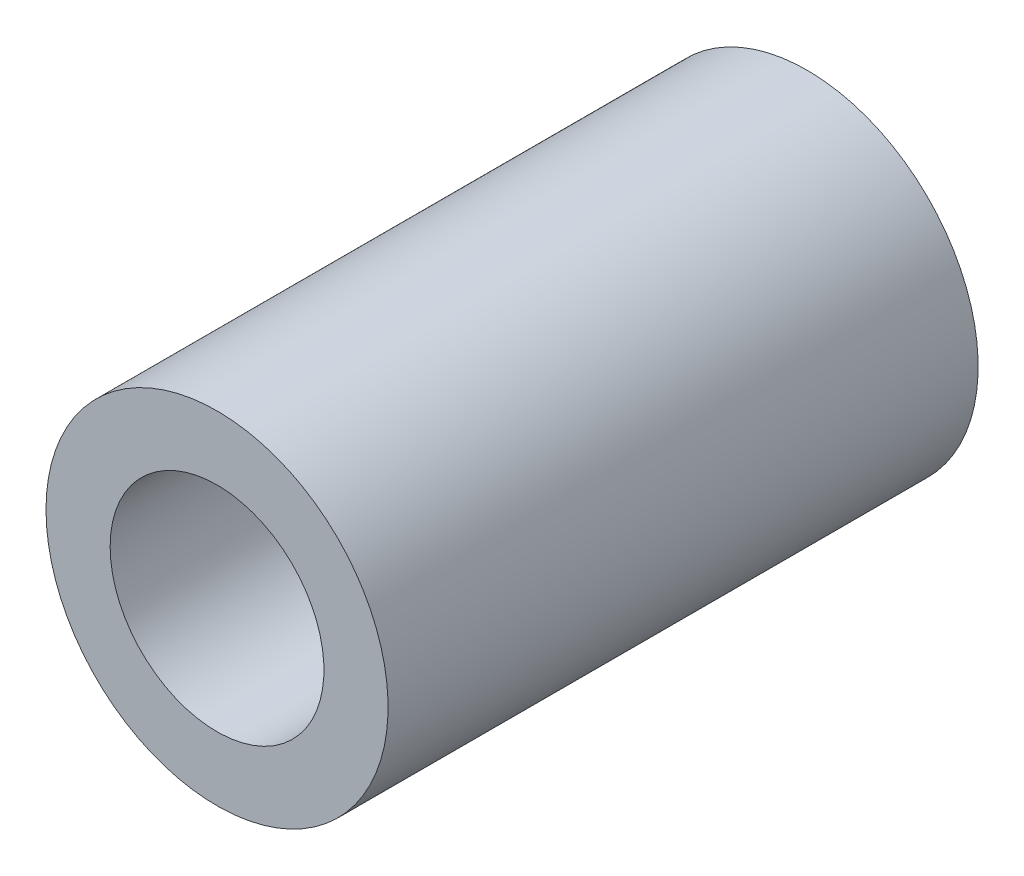
ISO-10303-21;
HEADER;
FILE_DESCRIPTION(('STEP AP214'),'2;1');
FILE_NAME('part.step','',(''),(''),'','','');
FILE_SCHEMA(('AUTOMOTIVE_DESIGN { 1 0 10303 214 1 1 1 1 }'));
ENDSEC;
DATA;
#1=APPLICATION_CONTEXT('core data for automotive mechanical design processes');
#2=APPLICATION_PROTOCOL_DEFINITION('international standard','automotive_design',2000,#1);
#3=PRODUCT_CONTEXT('',#1,'mechanical');
#4=PRODUCT('Part','Part','',(#3));
#5=PRODUCT_RELATED_PRODUCT_CATEGORY('part','',(#4));
#6=PRODUCT_DEFINITION_FORMATION('','',#4);
#7=PRODUCT_DEFINITION_CONTEXT('part definition',#1,'design');
#8=PRODUCT_DEFINITION('design','',#6,#7);
#9=PRODUCT_DEFINITION_SHAPE('','',#8);
#10=(LENGTH_UNIT() NAMED_UNIT(*) SI_UNIT(.MILLI.,.METRE.));
#11=(NAMED_UNIT(*) PLANE_ANGLE_UNIT() SI_UNIT($,.RADIAN.));
#12=(NAMED_UNIT(*) SI_UNIT($,.STERADIAN.) SOLID_ANGLE_UNIT());
#13=UNCERTAINTY_MEASURE_WITH_UNIT(LENGTH_MEASURE(1.E-05),#10,'distance_accuracy_value','');
#14=(GEOMETRIC_REPRESENTATION_CONTEXT(3) GLOBAL_UNCERTAINTY_ASSIGNED_CONTEXT((#13)) GLOBAL_UNIT_ASSIGNED_CONTEXT((#10,
#11,#12)) REPRESENTATION_CONTEXT('',''));
#15=CARTESIAN_POINT('',(0.,0.,0.));
#16=DIRECTION('',(0.,0.,1.));
#17=DIRECTION('',(1.,0.,0.));
#18=AXIS2_PLACEMENT_3D('',#15,#16,#17);
#19=CARTESIAN_POINT('',(0.,0.,13.8));
#20=DIRECTION('',(0.,0.,1.));
#21=DIRECTION('',(1.,0.,0.));
#22=AXIS2_PLACEMENT_3D('',#19,#20,#21);
#23=PLANE('',#22);
#24=CARTESIAN_POINT('',(0.,0.,13.8));
#25=DIRECTION('',(0.,0.,1.));
#26=DIRECTION('',(1.,0.,0.));
#27=AXIS2_PLACEMENT_3D('',#24,#25,#26);
#28=CIRCLE('',#27,4.);
#29=CARTESIAN_POINT('',(-4.,0.,13.8));
#30=VERTEX_POINT('',#29);
#31=EDGE_CURVE('E10',#30,#30,#28,.T.);
#32=ORIENTED_EDGE('',*,*,#31,.T.);
#33=EDGE_LOOP('',(#32));
#34=FACE_BOUND('',#33,.T.);
#35=CARTESIAN_POINT('',(0.,0.,13.8));
#36=DIRECTION('',(0.,0.,1.));
#37=DIRECTION('',(1.,0.,0.));
#38=AXIS2_PLACEMENT_3D('',#35,#36,#37);
#39=CIRCLE('',#38,2.5);
#40=CARTESIAN_POINT('',(-2.5,0.,13.8));
#41=VERTEX_POINT('',#40);
#42=EDGE_CURVE('E44',#41,#41,#39,.T.);
#43=ORIENTED_EDGE('',*,*,#42,.F.);
#44=EDGE_LOOP('',(#43));
#45=FACE_BOUND('',#44,.T.);
#46=ADVANCED_FACE('F33',(#34,#45),#23,.T.);
#47=CARTESIAN_POINT('',(0.,0.,0.));
#48=DIRECTION('',(0.,0.,1.));
#49=DIRECTION('',(1.,0.,0.));
#50=AXIS2_PLACEMENT_3D('',#47,#48,#49);
#51=PLANE('',#50);
#52=CARTESIAN_POINT('',(0.,0.,0.));
#53=DIRECTION('',(0.,0.,1.));
#54=DIRECTION('',(1.,0.,0.));
#55=AXIS2_PLACEMENT_3D('',#52,#53,#54);
#56=CIRCLE('',#55,4.);
#57=CARTESIAN_POINT('',(-4.,0.,0.));
#58=VERTEX_POINT('',#57);
#59=EDGE_CURVE('E37',#58,#58,#56,.T.);
#60=ORIENTED_EDGE('',*,*,#59,.F.);
#61=EDGE_LOOP('',(#60));
#62=FACE_BOUND('',#61,.T.);
#63=CARTESIAN_POINT('',(0.,0.,0.));
#64=DIRECTION('',(0.,0.,1.));
#65=DIRECTION('',(1.,0.,0.));
#66=AXIS2_PLACEMENT_3D('',#63,#64,#65);
#67=CIRCLE('',#66,2.5);
#68=CARTESIAN_POINT('',(-2.5,0.,0.));
#69=VERTEX_POINT('',#68);
#70=EDGE_CURVE('E46',#69,#69,#67,.T.);
#71=ORIENTED_EDGE('',*,*,#70,.T.);
#72=EDGE_LOOP('',(#71));
#73=FACE_BOUND('',#72,.T.);
#74=ADVANCED_FACE('F56',(#62,#73),#51,.F.);
#75=CARTESIAN_POINT('',(0.,0.,13.8));
#76=DIRECTION('',(0.,0.,-1.));
#77=DIRECTION('',(-1.,0.,0.));
#78=AXIS2_PLACEMENT_3D('',#75,#76,#77);
#79=CYLINDRICAL_SURFACE('',#78,4.);
#80=CARTESIAN_POINT('',(-4.,0.,13.8));
#81=CARTESIAN_POINT('',(-4.,0.,13.65625));
#82=CARTESIAN_POINT('',(-4.,0.,13.5125));
#83=CARTESIAN_POINT('',(-4.,0.,13.225));
#84=CARTESIAN_POINT('',(-4.,0.,13.08125));
#85=CARTESIAN_POINT('',(-4.,0.,12.79375));
#86=CARTESIAN_POINT('',(-4.,0.,12.65));
#87=CARTESIAN_POINT('',(-4.,0.,12.3625));
#88=CARTESIAN_POINT('',(-4.,0.,12.21875));
#89=CARTESIAN_POINT('',(-4.,0.,11.93125));
#90=CARTESIAN_POINT('',(-4.,0.,11.7875));
#91=CARTESIAN_POINT('',(-4.,0.,11.5));
#92=CARTESIAN_POINT('',(-4.,0.,11.35625));
#93=CARTESIAN_POINT('',(-4.,0.,11.06875));
#94=CARTESIAN_POINT('',(-4.,0.,10.925));
#95=CARTESIAN_POINT('',(-4.,0.,10.6375));
#96=CARTESIAN_POINT('',(-4.,0.,10.49375));
#97=CARTESIAN_POINT('',(-4.,0.,10.20625));
#98=CARTESIAN_POINT('',(-4.,0.,10.0625));
#99=CARTESIAN_POINT('',(-4.,0.,9.775));
#100=CARTESIAN_POINT('',(-4.,0.,9.63125));
#101=CARTESIAN_POINT('',(-4.,0.,9.34375));
#102=CARTESIAN_POINT('',(-4.,0.,9.2));
#103=CARTESIAN_POINT('',(-4.,0.,8.9125));
#104=CARTESIAN_POINT('',(-4.,0.,8.76875));
#105=CARTESIAN_POINT('',(-4.,0.,8.48125));
#106=CARTESIAN_POINT('',(-4.,0.,8.3375));
#107=CARTESIAN_POINT('',(-4.,0.,8.05));
#108=CARTESIAN_POINT('',(-4.,0.,7.90625));
#109=CARTESIAN_POINT('',(-4.,0.,7.61875));
#110=CARTESIAN_POINT('',(-4.,0.,7.475));
#111=CARTESIAN_POINT('',(-4.,0.,7.1875));
#112=CARTESIAN_POINT('',(-4.,0.,7.04375));
#113=CARTESIAN_POINT('',(-4.,0.,6.75625));
#114=CARTESIAN_POINT('',(-4.,0.,6.6125));
#115=CARTESIAN_POINT('',(-4.,0.,6.325));
#116=CARTESIAN_POINT('',(-4.,0.,6.18125));
#117=CARTESIAN_POINT('',(-4.,0.,5.89375));
#118=CARTESIAN_POINT('',(-4.,0.,5.75));
#119=CARTESIAN_POINT('',(-4.,0.,5.4625));
#120=CARTESIAN_POINT('',(-4.,0.,5.31875));
#121=CARTESIAN_POINT('',(-4.,0.,5.03125));
#122=CARTESIAN_POINT('',(-4.,0.,4.8875));
#123=CARTESIAN_POINT('',(-4.,0.,4.6));
#124=CARTESIAN_POINT('',(-4.,0.,4.45625));
#125=CARTESIAN_POINT('',(-4.,0.,4.16875));
#126=CARTESIAN_POINT('',(-4.,0.,4.025));
#127=CARTESIAN_POINT('',(-4.,0.,3.7375));
#128=CARTESIAN_POINT('',(-4.,0.,3.59375));
#129=CARTESIAN_POINT('',(-4.,0.,3.30625));
#130=CARTESIAN_POINT('',(-4.,0.,3.1625));
#131=CARTESIAN_POINT('',(-4.,0.,2.875));
#132=CARTESIAN_POINT('',(-4.,0.,2.73125));
#133=CARTESIAN_POINT('',(-4.,0.,2.44375));
#134=CARTESIAN_POINT('',(-4.,0.,2.3));
#135=CARTESIAN_POINT('',(-4.,0.,2.0125));
#136=CARTESIAN_POINT('',(-4.,0.,1.86875));
#137=CARTESIAN_POINT('',(-4.,0.,1.58125));
#138=CARTESIAN_POINT('',(-4.,0.,1.4375));
#139=CARTESIAN_POINT('',(-4.,0.,1.15));
#140=CARTESIAN_POINT('',(-4.,0.,1.00625));
#141=CARTESIAN_POINT('',(-4.,0.,0.71875));
#142=CARTESIAN_POINT('',(-4.,0.,0.575));
#143=CARTESIAN_POINT('',(-4.,0.,0.2875));
#144=CARTESIAN_POINT('',(-4.,0.,0.14375));
#145=CARTESIAN_POINT('',(-4.,0.,0.));
#146=B_SPLINE_CURVE_WITH_KNOTS('',3,(#80,#81,#82,#83,#84,#85,#86,#87,#88,#89,#90,#91,#92,#93,
#94,#95,#96,#97,#98,#99,#100,#101,#102,#103,#104,#105,#106,#107,#108,#109,#110,#111,#112,#113,
#114,#115,#116,#117,#118,#119,#120,#121,#122,#123,#124,#125,#126,#127,#128,#129,#130,#131,#132,
#133,#134,#135,#136,#137,#138,#139,#140,#141,#142,#143,#144,#145),.UNSPECIFIED.,.F.,.F.,(4,2,2,
2,2,2,2,2,2,2,2,2,2,2,2,2,2,2,2,2,2,2,2,2,2,2,2,2,2,2,2,2,4),(0.,0.431249999999999,
0.862499999999999,1.29375,1.725,2.15625,2.5875,3.01875,3.45,3.88125,4.3125,4.74375,5.175,
5.60625,6.0375,6.46875,6.9,7.33125,7.7625,8.19375,8.625,9.05625,9.4875,9.91875,10.35,10.78125,
11.2125,11.64375,12.075,12.50625,12.9375,13.36875,13.8),.UNSPECIFIED.);
#147=EDGE_CURVE('BSEAM35',#30,#58,#146,.T.);
#148=ORIENTED_EDGE('',*,*,#31,.F.);
#149=ORIENTED_EDGE('',*,*,#59,.T.);
#150=ORIENTED_EDGE('',*,*,#147,.T.);
#151=ORIENTED_EDGE('',*,*,#147,.F.);
#152=EDGE_LOOP('',(#148,#150,#149,#151));
#153=FACE_BOUND('',#152,.T.);
#154=ADVANCED_FACE('F35',(#153),#79,.T.);
#155=CARTESIAN_POINT('',(0.,0.,13.8));
#156=DIRECTION('',(0.,0.,-1.));
#157=DIRECTION('',(-1.,0.,0.));
#158=AXIS2_PLACEMENT_3D('',#155,#156,#157);
#159=CYLINDRICAL_SURFACE('',#158,2.5);
#160=CARTESIAN_POINT('',(-2.5,0.,13.8));
#161=CARTESIAN_POINT('',(-2.5,0.,13.65625));
#162=CARTESIAN_POINT('',(-2.5,0.,13.5125));
#163=CARTESIAN_POINT('',(-2.5,0.,13.225));
#164=CARTESIAN_POINT('',(-2.5,0.,13.08125));
#165=CARTESIAN_POINT('',(-2.5,0.,12.79375));
#166=CARTESIAN_POINT('',(-2.5,0.,12.65));
#167=CARTESIAN_POINT('',(-2.5,0.,12.3625));
#168=CARTESIAN_POINT('',(-2.5,0.,12.21875));
#169=CARTESIAN_POINT('',(-2.5,0.,11.93125));
#170=CARTESIAN_POINT('',(-2.5,0.,11.7875));
#171=CARTESIAN_POINT('',(-2.5,0.,11.5));
#172=CARTESIAN_POINT('',(-2.5,0.,11.35625));
#173=CARTESIAN_POINT('',(-2.5,0.,11.06875));
#174=CARTESIAN_POINT('',(-2.5,0.,10.925));
#175=CARTESIAN_POINT('',(-2.5,0.,10.6375));
#176=CARTESIAN_POINT('',(-2.5,0.,10.49375));
#177=CARTESIAN_POINT('',(-2.5,0.,10.20625));
#178=CARTESIAN_POINT('',(-2.5,0.,10.0625));
#179=CARTESIAN_POINT('',(-2.5,0.,9.775));
#180=CARTESIAN_POINT('',(-2.5,0.,9.63125));
#181=CARTESIAN_POINT('',(-2.5,0.,9.34375));
#182=CARTESIAN_POINT('',(-2.5,0.,9.2));
#183=CARTESIAN_POINT('',(-2.5,0.,8.9125));
#184=CARTESIAN_POINT('',(-2.5,0.,8.76875));
#185=CARTESIAN_POINT('',(-2.5,0.,8.48125));
#186=CARTESIAN_POINT('',(-2.5,0.,8.3375));
#187=CARTESIAN_POINT('',(-2.5,0.,8.05));
#188=CARTESIAN_POINT('',(-2.5,0.,7.90625));
#189=CARTESIAN_POINT('',(-2.5,0.,7.61875));
#190=CARTESIAN_POINT('',(-2.5,0.,7.475));
#191=CARTESIAN_POINT('',(-2.5,0.,7.1875));
#192=CARTESIAN_POINT('',(-2.5,0.,7.04375));
#193=CARTESIAN_POINT('',(-2.5,0.,6.75625));
#194=CARTESIAN_POINT('',(-2.5,0.,6.6125));
#195=CARTESIAN_POINT('',(-2.5,0.,6.325));
#196=CARTESIAN_POINT('',(-2.5,0.,6.18125));
#197=CARTESIAN_POINT('',(-2.5,0.,5.89375));
#198=CARTESIAN_POINT('',(-2.5,0.,5.75));
#199=CARTESIAN_POINT('',(-2.5,0.,5.4625));
#200=CARTESIAN_POINT('',(-2.5,0.,5.31875));
#201=CARTESIAN_POINT('',(-2.5,0.,5.03125));
#202=CARTESIAN_POINT('',(-2.5,0.,4.8875));
#203=CARTESIAN_POINT('',(-2.5,0.,4.6));
#204=CARTESIAN_POINT('',(-2.5,0.,4.45625));
#205=CARTESIAN_POINT('',(-2.5,0.,4.16875));
#206=CARTESIAN_POINT('',(-2.5,0.,4.025));
#207=CARTESIAN_POINT('',(-2.5,0.,3.7375));
#208=CARTESIAN_POINT('',(-2.5,0.,3.59375));
#209=CARTESIAN_POINT('',(-2.5,0.,3.30625));
#210=CARTESIAN_POINT('',(-2.5,0.,3.1625));
#211=CARTESIAN_POINT('',(-2.5,0.,2.875));
#212=CARTESIAN_POINT('',(-2.5,0.,2.73125));
#213=CARTESIAN_POINT('',(-2.5,0.,2.44375));
#214=CARTESIAN_POINT('',(-2.5,0.,2.3));
#215=CARTESIAN_POINT('',(-2.5,0.,2.0125));
#216=CARTESIAN_POINT('',(-2.5,0.,1.86875));
#217=CARTESIAN_POINT('',(-2.5,0.,1.58125));
#218=CARTESIAN_POINT('',(-2.5,0.,1.4375));
#219=CARTESIAN_POINT('',(-2.5,0.,1.15));
#220=CARTESIAN_POINT('',(-2.5,0.,1.00625));
#221=CARTESIAN_POINT('',(-2.5,0.,0.71875));
#222=CARTESIAN_POINT('',(-2.5,0.,0.575));
#223=CARTESIAN_POINT('',(-2.5,0.,0.2875));
#224=CARTESIAN_POINT('',(-2.5,0.,0.14375));
#225=CARTESIAN_POINT('',(-2.5,0.,0.));
#226=B_SPLINE_CURVE_WITH_KNOTS('',3,(#160,#161,#162,#163,#164,#165,#166,#167,#168,#169,#170,
#171,#172,#173,#174,#175,#176,#177,#178,#179,#180,#181,#182,#183,#184,#185,#186,#187,#188,#189,
#190,#191,#192,#193,#194,#195,#196,#197,#198,#199,#200,#201,#202,#203,#204,#205,#206,#207,#208,
#209,#210,#211,#212,#213,#214,#215,#216,#217,#218,#219,#220,#221,#222,#223,#224,#225),
.UNSPECIFIED.,.F.,.F.,(4,2,2,2,2,2,2,2,2,2,2,2,2,2,2,2,2,2,2,2,2,2,2,2,2,2,2,2,2,2,2,2,4),(0.,
0.431249999999999,0.862499999999999,1.29375,1.725,2.15625,2.5875,3.01875,3.45,3.88125,4.3125,
4.74375,5.175,5.60625,6.0375,6.46875,6.9,7.33125,7.7625,8.19375,8.625,9.05625,9.4875,9.91875,
10.35,10.78125,11.2125,11.64375,12.075,12.50625,12.9375,13.36875,13.8),.UNSPECIFIED.);
#227=EDGE_CURVE('BSEAM52',#41,#69,#226,.T.);
#228=ORIENTED_EDGE('',*,*,#42,.T.);
#229=ORIENTED_EDGE('',*,*,#70,.F.);
#230=ORIENTED_EDGE('',*,*,#227,.T.);
#231=ORIENTED_EDGE('',*,*,#227,.F.);
#232=EDGE_LOOP('',(#228,#230,#229,#231));
#233=FACE_BOUND('',#232,.T.);
#234=ADVANCED_FACE('F52',(#233),#159,.F.);
#235=CLOSED_SHELL('',(#46,#74,#154,#234));
#236=MANIFOLD_SOLID_BREP('B2',#235);
#237=ADVANCED_BREP_SHAPE_REPRESENTATION('',(#18,#236),#14);
#238=SHAPE_DEFINITION_REPRESENTATION(#9,#237);
ENDSEC;
END-ISO-10303-21;
